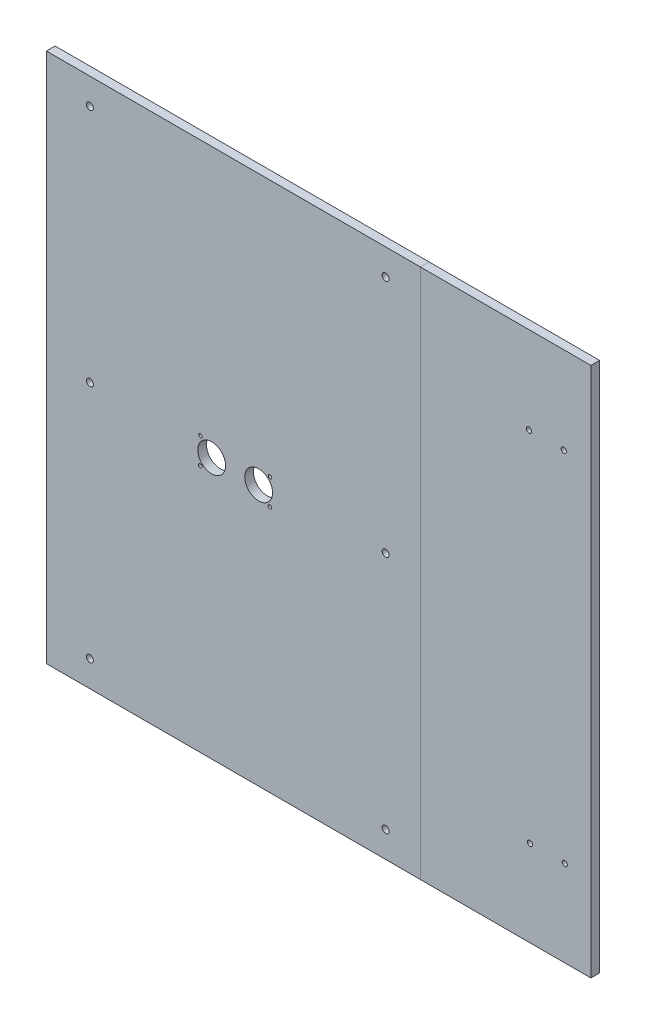
ISO-10303-21;
HEADER;
FILE_DESCRIPTION(('STEP AP214'),'2;1');
FILE_NAME('part.step','',(''),(''),'','','');
FILE_SCHEMA(('AUTOMOTIVE_DESIGN { 1 0 10303 214 1 1 1 1 }'));
ENDSEC;
DATA;
#1=APPLICATION_CONTEXT('core data for automotive mechanical design processes');
#2=APPLICATION_PROTOCOL_DEFINITION('international standard','automotive_design',2000,#1);
#3=PRODUCT_CONTEXT('',#1,'mechanical');
#4=PRODUCT('Part','Part','',(#3));
#5=PRODUCT_RELATED_PRODUCT_CATEGORY('part','',(#4));
#6=PRODUCT_DEFINITION_FORMATION('','',#4);
#7=PRODUCT_DEFINITION_CONTEXT('part definition',#1,'design');
#8=PRODUCT_DEFINITION('design','',#6,#7);
#9=PRODUCT_DEFINITION_SHAPE('','',#8);
#10=(LENGTH_UNIT() NAMED_UNIT(*) SI_UNIT(.MILLI.,.METRE.));
#11=(NAMED_UNIT(*) PLANE_ANGLE_UNIT() SI_UNIT($,.RADIAN.));
#12=(NAMED_UNIT(*) SI_UNIT($,.STERADIAN.) SOLID_ANGLE_UNIT());
#13=UNCERTAINTY_MEASURE_WITH_UNIT(LENGTH_MEASURE(1.E-05),#10,'distance_accuracy_value','');
#14=(GEOMETRIC_REPRESENTATION_CONTEXT(3) GLOBAL_UNCERTAINTY_ASSIGNED_CONTEXT((#13)) GLOBAL_UNIT_ASSIGNED_CONTEXT((#10,
#11,#12)) REPRESENTATION_CONTEXT('',''));
#15=CARTESIAN_POINT('',(0.,0.,0.));
#16=DIRECTION('',(0.,0.,1.));
#17=DIRECTION('',(1.,0.,0.));
#18=AXIS2_PLACEMENT_3D('',#15,#16,#17);
#19=CARTESIAN_POINT('',(215.,305.,5.));
#20=DIRECTION('',(-1.,0.,0.));
#21=DIRECTION('',(0.,0.,1.));
#22=AXIS2_PLACEMENT_3D('',#19,#20,#21);
#23=PLANE('',#22);
#24=DIRECTION('',(0.,1.,0.));
#25=VECTOR('',#24,1.);
#26=CARTESIAN_POINT('',(215.,305.,0.));
#27=LINE('',#26,#25);
#28=CARTESIAN_POINT('',(215.,0.,0.));
#29=VERTEX_POINT('',#28);
#30=CARTESIAN_POINT('',(215.,305.,0.));
#31=VERTEX_POINT('',#30);
#32=EDGE_CURVE('E108',#29,#31,#27,.T.);
#33=ORIENTED_EDGE('',*,*,#32,.F.);
#34=DIRECTION('',(0.,0.,-1.));
#35=VECTOR('',#34,1.);
#36=CARTESIAN_POINT('',(215.,0.,5.));
#37=LINE('',#36,#35);
#38=CARTESIAN_POINT('',(215.,0.,5.));
#39=VERTEX_POINT('',#38);
#40=EDGE_CURVE('E12',#39,#29,#37,.T.);
#41=ORIENTED_EDGE('',*,*,#40,.F.);
#42=DIRECTION('',(0.,1.,0.));
#43=VECTOR('',#42,1.);
#44=CARTESIAN_POINT('',(215.,305.,5.));
#45=LINE('',#44,#43);
#46=CARTESIAN_POINT('',(215.,305.,5.));
#47=VERTEX_POINT('',#46);
#48=EDGE_CURVE('E101',#39,#47,#45,.T.);
#49=ORIENTED_EDGE('',*,*,#48,.T.);
#50=DIRECTION('',(0.,0.,-1.));
#51=VECTOR('',#50,1.);
#52=CARTESIAN_POINT('',(215.,305.,5.));
#53=LINE('',#52,#51);
#54=EDGE_CURVE('E46',#47,#31,#53,.T.);
#55=ORIENTED_EDGE('',*,*,#54,.T.);
#56=EDGE_LOOP('',(#33,#41,#49,#55));
#57=FACE_BOUND('',#56,.T.);
#58=ADVANCED_FACE('F43',(#57),#23,.T.);
#59=CARTESIAN_POINT('',(215.,0.,5.));
#60=DIRECTION('',(0.,-1.,0.));
#61=DIRECTION('',(1.,0.,0.));
#62=AXIS2_PLACEMENT_3D('',#59,#60,#61);
#63=PLANE('',#62);
#64=DIRECTION('',(-1.,0.,0.));
#65=VECTOR('',#64,1.);
#66=CARTESIAN_POINT('',(215.,0.,0.));
#67=LINE('',#66,#65);
#68=CARTESIAN_POINT('',(313.,0.,0.));
#69=VERTEX_POINT('',#68);
#70=EDGE_CURVE('E103',#69,#29,#67,.T.);
#71=ORIENTED_EDGE('',*,*,#70,.F.);
#72=DIRECTION('',(0.,0.,-1.));
#73=VECTOR('',#72,1.);
#74=CARTESIAN_POINT('',(313.,0.,5.));
#75=LINE('',#74,#73);
#76=CARTESIAN_POINT('',(313.,0.,5.));
#77=VERTEX_POINT('',#76);
#78=EDGE_CURVE('E52',#77,#69,#75,.T.);
#79=ORIENTED_EDGE('',*,*,#78,.F.);
#80=DIRECTION('',(-1.,0.,0.));
#81=VECTOR('',#80,1.);
#82=CARTESIAN_POINT('',(215.,0.,5.));
#83=LINE('',#82,#81);
#84=EDGE_CURVE('E98',#77,#39,#83,.T.);
#85=ORIENTED_EDGE('',*,*,#84,.T.);
#86=ORIENTED_EDGE('',*,*,#40,.T.);
#87=EDGE_LOOP('',(#71,#79,#85,#86));
#88=FACE_BOUND('',#87,.T.);
#89=ADVANCED_FACE('F119',(#88),#63,.T.);
#90=CARTESIAN_POINT('',(313.,305.,5.));
#91=DIRECTION('',(1.,0.,0.));
#92=DIRECTION('',(0.,0.,-1.));
#93=AXIS2_PLACEMENT_3D('',#90,#91,#92);
#94=PLANE('',#93);
#95=DIRECTION('',(0.,-1.,0.));
#96=VECTOR('',#95,1.);
#97=CARTESIAN_POINT('',(313.,305.,0.));
#98=LINE('',#97,#96);
#99=CARTESIAN_POINT('',(313.,305.,0.));
#100=VERTEX_POINT('',#99);
#101=EDGE_CURVE('E93',#100,#69,#98,.T.);
#102=ORIENTED_EDGE('',*,*,#101,.F.);
#103=DIRECTION('',(0.,0.,-1.));
#104=VECTOR('',#103,1.);
#105=CARTESIAN_POINT('',(313.,305.,5.));
#106=LINE('',#105,#104);
#107=CARTESIAN_POINT('',(313.,305.,5.));
#108=VERTEX_POINT('',#107);
#109=EDGE_CURVE('E88',#108,#100,#106,.T.);
#110=ORIENTED_EDGE('',*,*,#109,.F.);
#111=DIRECTION('',(0.,-1.,0.));
#112=VECTOR('',#111,1.);
#113=CARTESIAN_POINT('',(313.,305.,5.));
#114=LINE('',#113,#112);
#115=EDGE_CURVE('E91',#108,#77,#114,.T.);
#116=ORIENTED_EDGE('',*,*,#115,.T.);
#117=ORIENTED_EDGE('',*,*,#78,.T.);
#118=EDGE_LOOP('',(#102,#110,#116,#117));
#119=FACE_BOUND('',#118,.T.);
#120=ADVANCED_FACE('F90',(#119),#94,.T.);
#121=CARTESIAN_POINT('',(215.,305.,5.));
#122=DIRECTION('',(0.,1.,0.));
#123=DIRECTION('',(0.,0.,1.));
#124=AXIS2_PLACEMENT_3D('',#121,#122,#123);
#125=PLANE('',#124);
#126=DIRECTION('',(1.,0.,0.));
#127=VECTOR('',#126,1.);
#128=CARTESIAN_POINT('',(215.,305.,0.));
#129=LINE('',#128,#127);
#130=EDGE_CURVE('E111',#31,#100,#129,.T.);
#131=ORIENTED_EDGE('',*,*,#130,.F.);
#132=ORIENTED_EDGE('',*,*,#54,.F.);
#133=DIRECTION('',(1.,0.,0.));
#134=VECTOR('',#133,1.);
#135=CARTESIAN_POINT('',(215.,305.,5.));
#136=LINE('',#135,#134);
#137=EDGE_CURVE('E97',#47,#108,#136,.T.);
#138=ORIENTED_EDGE('',*,*,#137,.T.);
#139=ORIENTED_EDGE('',*,*,#109,.T.);
#140=EDGE_LOOP('',(#131,#132,#138,#139));
#141=FACE_BOUND('',#140,.T.);
#142=ADVANCED_FACE('F100',(#141),#125,.T.);
#143=CARTESIAN_POINT('',(0.,0.,5.));
#144=DIRECTION('',(0.,0.,1.));
#145=DIRECTION('',(1.,0.,0.));
#146=AXIS2_PLACEMENT_3D('',#143,#144,#145);
#147=PLANE('',#146);
#148=CARTESIAN_POINT('',(298.,49.5000000000006,5.));
#149=DIRECTION('',(0.,0.,1.));
#150=DIRECTION('',(1.,0.,0.));
#151=AXIS2_PLACEMENT_3D('',#148,#149,#150);
#152=CIRCLE('',#151,1.50000000000002);
#153=CARTESIAN_POINT('',(299.5,49.5000000000006,5.));
#154=VERTEX_POINT('',#153);
#155=EDGE_CURVE('E163',#154,#154,#152,.T.);
#156=ORIENTED_EDGE('',*,*,#155,.F.);
#157=EDGE_LOOP('',(#156));
#158=FACE_BOUND('',#157,.T.);
#159=CARTESIAN_POINT('',(278.,49.5000000000006,5.));
#160=DIRECTION('',(0.,0.,1.));
#161=DIRECTION('',(1.,0.,0.));
#162=AXIS2_PLACEMENT_3D('',#159,#160,#161);
#163=CIRCLE('',#162,1.50000000000002);
#164=CARTESIAN_POINT('',(279.5,49.5000000000006,5.));
#165=VERTEX_POINT('',#164);
#166=EDGE_CURVE('E165',#165,#165,#163,.T.);
#167=ORIENTED_EDGE('',*,*,#166,.F.);
#168=EDGE_LOOP('',(#167));
#169=FACE_BOUND('',#168,.T.);
#170=CARTESIAN_POINT('',(297.4,255.,5.));
#171=DIRECTION('',(0.,0.,-1.));
#172=DIRECTION('',(-1.,0.,0.));
#173=AXIS2_PLACEMENT_3D('',#170,#171,#172);
#174=CIRCLE('',#173,1.50000000000002);
#175=CARTESIAN_POINT('',(295.9,255.,5.));
#176=VERTEX_POINT('',#175);
#177=EDGE_CURVE('E174',#176,#176,#174,.T.);
#178=ORIENTED_EDGE('',*,*,#177,.T.);
#179=EDGE_LOOP('',(#178));
#180=FACE_BOUND('',#179,.T.);
#181=CARTESIAN_POINT('',(277.4,255.,5.));
#182=DIRECTION('',(0.,0.,-1.));
#183=DIRECTION('',(-1.,0.,0.));
#184=AXIS2_PLACEMENT_3D('',#181,#182,#183);
#185=CIRCLE('',#184,1.50000000000002);
#186=CARTESIAN_POINT('',(275.9,255.,5.));
#187=VERTEX_POINT('',#186);
#188=EDGE_CURVE('E112',#187,#187,#185,.T.);
#189=ORIENTED_EDGE('',*,*,#188,.T.);
#190=EDGE_LOOP('',(#189));
#191=FACE_BOUND('',#190,.T.);
#192=ORIENTED_EDGE('',*,*,#48,.F.);
#193=ORIENTED_EDGE('',*,*,#84,.F.);
#194=ORIENTED_EDGE('',*,*,#115,.F.);
#195=ORIENTED_EDGE('',*,*,#137,.F.);
#196=EDGE_LOOP('',(#192,#193,#194,#195));
#197=FACE_BOUND('',#196,.T.);
#198=ADVANCED_FACE('F96',(#158,#169,#180,#191,#197),#147,.T.);
#199=CARTESIAN_POINT('',(0.,0.,0.));
#200=DIRECTION('',(0.,0.,1.));
#201=DIRECTION('',(1.,0.,0.));
#202=AXIS2_PLACEMENT_3D('',#199,#200,#201);
#203=PLANE('',#202);
#204=CARTESIAN_POINT('',(298.,49.5000000000006,0.));
#205=DIRECTION('',(0.,0.,1.));
#206=DIRECTION('',(1.,0.,0.));
#207=AXIS2_PLACEMENT_3D('',#204,#205,#206);
#208=CIRCLE('',#207,1.50000000000002);
#209=CARTESIAN_POINT('',(299.5,49.5000000000006,0.));
#210=VERTEX_POINT('',#209);
#211=EDGE_CURVE('E161',#210,#210,#208,.T.);
#212=ORIENTED_EDGE('',*,*,#211,.T.);
#213=EDGE_LOOP('',(#212));
#214=FACE_BOUND('',#213,.T.);
#215=CARTESIAN_POINT('',(278.,49.5000000000006,0.));
#216=DIRECTION('',(0.,0.,1.));
#217=DIRECTION('',(1.,0.,0.));
#218=AXIS2_PLACEMENT_3D('',#215,#216,#217);
#219=CIRCLE('',#218,1.50000000000002);
#220=CARTESIAN_POINT('',(279.5,49.5000000000006,0.));
#221=VERTEX_POINT('',#220);
#222=EDGE_CURVE('E168',#221,#221,#219,.T.);
#223=ORIENTED_EDGE('',*,*,#222,.T.);
#224=EDGE_LOOP('',(#223));
#225=FACE_BOUND('',#224,.T.);
#226=CARTESIAN_POINT('',(297.4,255.,0.));
#227=DIRECTION('',(0.,0.,-1.));
#228=DIRECTION('',(-1.,0.,0.));
#229=AXIS2_PLACEMENT_3D('',#226,#227,#228);
#230=CIRCLE('',#229,1.50000000000002);
#231=CARTESIAN_POINT('',(295.9,255.,0.));
#232=VERTEX_POINT('',#231);
#233=EDGE_CURVE('E171',#232,#232,#230,.T.);
#234=ORIENTED_EDGE('',*,*,#233,.F.);
#235=EDGE_LOOP('',(#234));
#236=FACE_BOUND('',#235,.T.);
#237=CARTESIAN_POINT('',(277.4,255.,0.));
#238=DIRECTION('',(0.,0.,-1.));
#239=DIRECTION('',(-1.,0.,0.));
#240=AXIS2_PLACEMENT_3D('',#237,#238,#239);
#241=CIRCLE('',#240,1.50000000000002);
#242=CARTESIAN_POINT('',(275.9,255.,0.));
#243=VERTEX_POINT('',#242);
#244=EDGE_CURVE('E177',#243,#243,#241,.T.);
#245=ORIENTED_EDGE('',*,*,#244,.F.);
#246=EDGE_LOOP('',(#245));
#247=FACE_BOUND('',#246,.T.);
#248=ORIENTED_EDGE('',*,*,#32,.T.);
#249=ORIENTED_EDGE('',*,*,#130,.T.);
#250=ORIENTED_EDGE('',*,*,#101,.T.);
#251=ORIENTED_EDGE('',*,*,#70,.T.);
#252=EDGE_LOOP('',(#248,#249,#250,#251));
#253=FACE_BOUND('',#252,.T.);
#254=ADVANCED_FACE('F118',(#214,#225,#236,#247,#253),#203,.F.);
#255=CARTESIAN_POINT('',(277.4,255.,5.));
#256=DIRECTION('',(0.,0.,-1.));
#257=DIRECTION('',(-1.,0.,0.));
#258=AXIS2_PLACEMENT_3D('',#255,#256,#257);
#259=CYLINDRICAL_SURFACE('',#258,1.50000000000002);
#260=ORIENTED_EDGE('',*,*,#188,.F.);
#261=EDGE_LOOP('',(#260));
#262=FACE_BOUND('',#261,.T.);
#263=ORIENTED_EDGE('',*,*,#244,.T.);
#264=EDGE_LOOP('',(#263));
#265=FACE_BOUND('',#264,.T.);
#266=ADVANCED_FACE('F137',(#262,#265),#259,.F.);
#267=CARTESIAN_POINT('',(297.4,255.,5.));
#268=DIRECTION('',(0.,0.,-1.));
#269=DIRECTION('',(-1.,0.,0.));
#270=AXIS2_PLACEMENT_3D('',#267,#268,#269);
#271=CYLINDRICAL_SURFACE('',#270,1.50000000000002);
#272=ORIENTED_EDGE('',*,*,#177,.F.);
#273=EDGE_LOOP('',(#272));
#274=FACE_BOUND('',#273,.T.);
#275=ORIENTED_EDGE('',*,*,#233,.T.);
#276=EDGE_LOOP('',(#275));
#277=FACE_BOUND('',#276,.T.);
#278=ADVANCED_FACE('F144',(#274,#277),#271,.F.);
#279=CARTESIAN_POINT('',(278.,49.5000000000006,0.));
#280=DIRECTION('',(0.,0.,1.));
#281=DIRECTION('',(1.,0.,0.));
#282=AXIS2_PLACEMENT_3D('',#279,#280,#281);
#283=CYLINDRICAL_SURFACE('',#282,1.50000000000002);
#284=ORIENTED_EDGE('',*,*,#222,.F.);
#285=EDGE_LOOP('',(#284));
#286=FACE_BOUND('',#285,.T.);
#287=ORIENTED_EDGE('',*,*,#166,.T.);
#288=EDGE_LOOP('',(#287));
#289=FACE_BOUND('',#288,.T.);
#290=ADVANCED_FACE('F148',(#286,#289),#283,.F.);
#291=CARTESIAN_POINT('',(298.,49.5000000000006,0.));
#292=DIRECTION('',(0.,0.,1.));
#293=DIRECTION('',(1.,0.,0.));
#294=AXIS2_PLACEMENT_3D('',#291,#292,#293);
#295=CYLINDRICAL_SURFACE('',#294,1.50000000000002);
#296=ORIENTED_EDGE('',*,*,#211,.F.);
#297=EDGE_LOOP('',(#296));
#298=FACE_BOUND('',#297,.T.);
#299=ORIENTED_EDGE('',*,*,#155,.T.);
#300=EDGE_LOOP('',(#299));
#301=FACE_BOUND('',#300,.T.);
#302=ADVANCED_FACE('F152',(#298,#301),#295,.F.);
#303=CLOSED_SHELL('',(#58,#89,#120,#142,#198,#254,#266,#278,#290,#302));
#304=MANIFOLD_SOLID_BREP('B2',#303);
#305=CARTESIAN_POINT('',(0.,0.,5.));
#306=DIRECTION('',(1.,0.,0.));
#307=DIRECTION('',(0.,0.,-1.));
#308=AXIS2_PLACEMENT_3D('',#305,#306,#307);
#309=PLANE('',#308);
#310=DIRECTION('',(0.,-1.,0.));
#311=VECTOR('',#310,1.);
#312=CARTESIAN_POINT('',(0.,0.,0.));
#313=LINE('',#312,#311);
#314=CARTESIAN_POINT('',(0.,305.,0.));
#315=VERTEX_POINT('',#314);
#316=CARTESIAN_POINT('',(0.,0.,0.));
#317=VERTEX_POINT('',#316);
#318=EDGE_CURVE('E313',#315,#317,#313,.T.);
#319=ORIENTED_EDGE('',*,*,#318,.T.);
#320=DIRECTION('',(0.,0.,-1.));
#321=VECTOR('',#320,1.);
#322=CARTESIAN_POINT('',(0.,0.,5.));
#323=LINE('',#322,#321);
#324=CARTESIAN_POINT('',(0.,0.,5.));
#325=VERTEX_POINT('',#324);
#326=EDGE_CURVE('E41',#325,#317,#323,.T.);
#327=ORIENTED_EDGE('',*,*,#326,.F.);
#328=DIRECTION('',(0.,-1.,0.));
#329=VECTOR('',#328,1.);
#330=CARTESIAN_POINT('',(0.,0.,5.));
#331=LINE('',#330,#329);
#332=CARTESIAN_POINT('',(0.,305.,5.));
#333=VERTEX_POINT('',#332);
#334=EDGE_CURVE('E301',#333,#325,#331,.T.);
#335=ORIENTED_EDGE('',*,*,#334,.F.);
#336=DIRECTION('',(0.,0.,-1.));
#337=VECTOR('',#336,1.);
#338=CARTESIAN_POINT('',(0.,305.,5.));
#339=LINE('',#338,#337);
#340=EDGE_CURVE('E309',#333,#315,#339,.T.);
#341=ORIENTED_EDGE('',*,*,#340,.T.);
#342=EDGE_LOOP('',(#319,#327,#335,#341));
#343=FACE_BOUND('',#342,.T.);
#344=ADVANCED_FACE('F250',(#343),#309,.F.);
#345=CARTESIAN_POINT('',(0.,0.,5.));
#346=DIRECTION('',(0.,1.,0.));
#347=DIRECTION('',(0.,0.,1.));
#348=AXIS2_PLACEMENT_3D('',#345,#346,#347);
#349=PLANE('',#348);
#350=DIRECTION('',(1.,0.,0.));
#351=VECTOR('',#350,1.);
#352=CARTESIAN_POINT('',(0.,0.,0.));
#353=LINE('',#352,#351);
#354=CARTESIAN_POINT('',(215.,0.,0.));
#355=VERTEX_POINT('',#354);
#356=EDGE_CURVE('E305',#317,#355,#353,.T.);
#357=ORIENTED_EDGE('',*,*,#356,.T.);
#358=DIRECTION('',(0.,0.,-1.));
#359=VECTOR('',#358,1.);
#360=CARTESIAN_POINT('',(215.,0.,5.));
#361=LINE('',#360,#359);
#362=CARTESIAN_POINT('',(215.,0.,5.));
#363=VERTEX_POINT('',#362);
#364=EDGE_CURVE('E258',#363,#355,#361,.T.);
#365=ORIENTED_EDGE('',*,*,#364,.F.);
#366=DIRECTION('',(1.,0.,0.));
#367=VECTOR('',#366,1.);
#368=CARTESIAN_POINT('',(0.,0.,5.));
#369=LINE('',#368,#367);
#370=EDGE_CURVE('E296',#325,#363,#369,.T.);
#371=ORIENTED_EDGE('',*,*,#370,.F.);
#372=ORIENTED_EDGE('',*,*,#326,.T.);
#373=EDGE_LOOP('',(#357,#365,#371,#372));
#374=FACE_BOUND('',#373,.T.);
#375=ADVANCED_FACE('F304',(#374),#349,.F.);
#376=CARTESIAN_POINT('',(215.,0.,5.));
#377=DIRECTION('',(-1.,0.,0.));
#378=DIRECTION('',(0.,0.,1.));
#379=AXIS2_PLACEMENT_3D('',#376,#377,#378);
#380=PLANE('',#379);
#381=DIRECTION('',(0.,1.,0.));
#382=VECTOR('',#381,1.);
#383=CARTESIAN_POINT('',(215.,0.,0.));
#384=LINE('',#383,#382);
#385=CARTESIAN_POINT('',(215.,305.,0.));
#386=VERTEX_POINT('',#385);
#387=EDGE_CURVE('E283',#355,#386,#384,.T.);
#388=ORIENTED_EDGE('',*,*,#387,.T.);
#389=DIRECTION('',(0.,0.,-1.));
#390=VECTOR('',#389,1.);
#391=CARTESIAN_POINT('',(215.,305.,5.));
#392=LINE('',#391,#390);
#393=CARTESIAN_POINT('',(215.,305.,5.));
#394=VERTEX_POINT('',#393);
#395=EDGE_CURVE('E306',#394,#386,#392,.T.);
#396=ORIENTED_EDGE('',*,*,#395,.F.);
#397=DIRECTION('',(0.,1.,0.));
#398=VECTOR('',#397,1.);
#399=CARTESIAN_POINT('',(215.,0.,5.));
#400=LINE('',#399,#398);
#401=EDGE_CURVE('E299',#363,#394,#400,.T.);
#402=ORIENTED_EDGE('',*,*,#401,.F.);
#403=ORIENTED_EDGE('',*,*,#364,.T.);
#404=EDGE_LOOP('',(#388,#396,#402,#403));
#405=FACE_BOUND('',#404,.T.);
#406=ADVANCED_FACE('F307',(#405),#380,.F.);
#407=CARTESIAN_POINT('',(0.,305.,5.));
#408=DIRECTION('',(0.,-1.,0.));
#409=DIRECTION('',(0.,0.,-1.));
#410=AXIS2_PLACEMENT_3D('',#407,#408,#409);
#411=PLANE('',#410);
#412=DIRECTION('',(-1.,0.,0.));
#413=VECTOR('',#412,1.);
#414=CARTESIAN_POINT('',(0.,305.,0.));
#415=LINE('',#414,#413);
#416=EDGE_CURVE('E289',#386,#315,#415,.T.);
#417=ORIENTED_EDGE('',*,*,#416,.T.);
#418=ORIENTED_EDGE('',*,*,#340,.F.);
#419=DIRECTION('',(-1.,0.,0.));
#420=VECTOR('',#419,1.);
#421=CARTESIAN_POINT('',(0.,305.,5.));
#422=LINE('',#421,#420);
#423=EDGE_CURVE('E266',#394,#333,#422,.T.);
#424=ORIENTED_EDGE('',*,*,#423,.F.);
#425=ORIENTED_EDGE('',*,*,#395,.T.);
#426=EDGE_LOOP('',(#417,#418,#424,#425));
#427=FACE_BOUND('',#426,.T.);
#428=ADVANCED_FACE('F321',(#427),#411,.F.);
#429=CARTESIAN_POINT('',(0.,0.,5.));
#430=DIRECTION('',(0.,0.,-1.));
#431=DIRECTION('',(-1.,0.,0.));
#432=AXIS2_PLACEMENT_3D('',#429,#430,#431);
#433=PLANE('',#432);
#434=CARTESIAN_POINT('',(128.451980771845,142.285475877277,5.));
#435=DIRECTION('',(0.,0.,-1.));
#436=DIRECTION('',(-1.,0.,0.));
#437=AXIS2_PLACEMENT_3D('',#434,#435,#436);
#438=CIRCLE('',#437,0.999999999999998);
#439=CARTESIAN_POINT('',(127.451980771845,142.285475877277,5.));
#440=VERTEX_POINT('',#439);
#441=EDGE_CURVE('E378',#440,#440,#438,.T.);
#442=ORIENTED_EDGE('',*,*,#441,.T.);
#443=EDGE_LOOP('',(#442));
#444=FACE_BOUND('',#443,.T.);
#445=CARTESIAN_POINT('',(88.5480363246736,157.714598256853,5.));
#446=DIRECTION('',(0.,0.,-1.));
#447=DIRECTION('',(-1.,0.,0.));
#448=AXIS2_PLACEMENT_3D('',#445,#446,#447);
#449=CIRCLE('',#448,0.999999999999998);
#450=CARTESIAN_POINT('',(87.5480363246736,157.714598256853,5.));
#451=VERTEX_POINT('',#450);
#452=EDGE_CURVE('E390',#451,#451,#449,.T.);
#453=ORIENTED_EDGE('',*,*,#452,.T.);
#454=EDGE_LOOP('',(#453));
#455=FACE_BOUND('',#454,.T.);
#456=CARTESIAN_POINT('',(88.4519475760372,142.714598256853,5.));
#457=DIRECTION('',(0.,0.,-1.));
#458=DIRECTION('',(-1.,0.,0.));
#459=AXIS2_PLACEMENT_3D('',#456,#457,#458);
#460=CIRCLE('',#459,0.999999999999998);
#461=CARTESIAN_POINT('',(87.4519475760372,142.714598256853,5.));
#462=VERTEX_POINT('',#461);
#463=EDGE_CURVE('E384',#462,#462,#460,.T.);
#464=ORIENTED_EDGE('',*,*,#463,.T.);
#465=EDGE_LOOP('',(#464));
#466=FACE_BOUND('',#465,.T.);
#467=CARTESIAN_POINT('',(128.548036324674,157.285475877277,5.));
#468=DIRECTION('',(0.,0.,-1.));
#469=DIRECTION('',(-1.,0.,0.));
#470=AXIS2_PLACEMENT_3D('',#467,#468,#469);
#471=CIRCLE('',#470,0.999999999999998);
#472=CARTESIAN_POINT('',(127.548036324674,157.285475877277,5.));
#473=VERTEX_POINT('',#472);
#474=EDGE_CURVE('E372',#473,#473,#471,.T.);
#475=ORIENTED_EDGE('',*,*,#474,.T.);
#476=EDGE_LOOP('',(#475));
#477=FACE_BOUND('',#476,.T.);
#478=CARTESIAN_POINT('',(95.,150.,5.));
#479=DIRECTION('',(0.,0.,-1.));
#480=DIRECTION('',(-1.,0.,0.));
#481=AXIS2_PLACEMENT_3D('',#478,#479,#480);
#482=CIRCLE('',#481,8.00000000000003);
#483=CARTESIAN_POINT('',(87.,150.,5.));
#484=VERTEX_POINT('',#483);
#485=EDGE_CURVE('E366',#484,#484,#482,.T.);
#486=ORIENTED_EDGE('',*,*,#485,.T.);
#487=EDGE_LOOP('',(#486));
#488=FACE_BOUND('',#487,.T.);
#489=CARTESIAN_POINT('',(122.,150.,5.));
#490=DIRECTION('',(0.,0.,-1.));
#491=DIRECTION('',(-1.,0.,0.));
#492=AXIS2_PLACEMENT_3D('',#489,#490,#491);
#493=CIRCLE('',#492,8.00000000000003);
#494=CARTESIAN_POINT('',(114.,150.,5.));
#495=VERTEX_POINT('',#494);
#496=EDGE_CURVE('E349',#495,#495,#493,.T.);
#497=ORIENTED_EDGE('',*,*,#496,.T.);
#498=EDGE_LOOP('',(#497));
#499=FACE_BOUND('',#498,.T.);
#500=CARTESIAN_POINT('',(25.,152.5,5.));
#501=DIRECTION('',(0.,0.,-1.));
#502=DIRECTION('',(-1.,0.,0.));
#503=AXIS2_PLACEMENT_3D('',#500,#501,#502);
#504=CIRCLE('',#503,2.);
#505=CARTESIAN_POINT('',(23.,152.5,5.));
#506=VERTEX_POINT('',#505);
#507=EDGE_CURVE('E348',#506,#506,#504,.T.);
#508=ORIENTED_EDGE('',*,*,#507,.T.);
#509=EDGE_LOOP('',(#508));
#510=FACE_BOUND('',#509,.T.);
#511=CARTESIAN_POINT('',(195.,152.5,5.));
#512=DIRECTION('',(0.,0.,-1.));
#513=DIRECTION('',(-1.,0.,0.));
#514=AXIS2_PLACEMENT_3D('',#511,#512,#513);
#515=CIRCLE('',#514,2.);
#516=CARTESIAN_POINT('',(193.,152.5,5.));
#517=VERTEX_POINT('',#516);
#518=EDGE_CURVE('E355',#517,#517,#515,.T.);
#519=ORIENTED_EDGE('',*,*,#518,.T.);
#520=EDGE_LOOP('',(#519));
#521=FACE_BOUND('',#520,.T.);
#522=CARTESIAN_POINT('',(195.,15.,5.));
#523=DIRECTION('',(0.,0.,-1.));
#524=DIRECTION('',(-1.,0.,0.));
#525=AXIS2_PLACEMENT_3D('',#522,#523,#524);
#526=CIRCLE('',#525,2.);
#527=CARTESIAN_POINT('',(193.,15.,5.));
#528=VERTEX_POINT('',#527);
#529=EDGE_CURVE('E337',#528,#528,#526,.T.);
#530=ORIENTED_EDGE('',*,*,#529,.T.);
#531=EDGE_LOOP('',(#530));
#532=FACE_BOUND('',#531,.T.);
#533=CARTESIAN_POINT('',(25.,15.,5.));
#534=DIRECTION('',(0.,0.,-1.));
#535=DIRECTION('',(-1.,0.,0.));
#536=AXIS2_PLACEMENT_3D('',#533,#534,#535);
#537=CIRCLE('',#536,2.);
#538=CARTESIAN_POINT('',(23.,15.,5.));
#539=VERTEX_POINT('',#538);
#540=EDGE_CURVE('E336',#539,#539,#537,.T.);
#541=ORIENTED_EDGE('',*,*,#540,.T.);
#542=EDGE_LOOP('',(#541));
#543=FACE_BOUND('',#542,.T.);
#544=CARTESIAN_POINT('',(25.,290.,5.));
#545=DIRECTION('',(0.,0.,-1.));
#546=DIRECTION('',(-1.,0.,0.));
#547=AXIS2_PLACEMENT_3D('',#544,#545,#546);
#548=CIRCLE('',#547,2.00000000000001);
#549=CARTESIAN_POINT('',(23.,290.,5.));
#550=VERTEX_POINT('',#549);
#551=EDGE_CURVE('E330',#550,#550,#548,.T.);
#552=ORIENTED_EDGE('',*,*,#551,.T.);
#553=EDGE_LOOP('',(#552));
#554=FACE_BOUND('',#553,.T.);
#555=CARTESIAN_POINT('',(195.,290.,5.));
#556=DIRECTION('',(0.,0.,-1.));
#557=DIRECTION('',(-1.,0.,0.));
#558=AXIS2_PLACEMENT_3D('',#555,#556,#557);
#559=CIRCLE('',#558,2.);
#560=CARTESIAN_POINT('',(193.,290.,5.));
#561=VERTEX_POINT('',#560);
#562=EDGE_CURVE('E316',#561,#561,#559,.T.);
#563=ORIENTED_EDGE('',*,*,#562,.T.);
#564=EDGE_LOOP('',(#563));
#565=FACE_BOUND('',#564,.T.);
#566=ORIENTED_EDGE('',*,*,#334,.T.);
#567=ORIENTED_EDGE('',*,*,#370,.T.);
#568=ORIENTED_EDGE('',*,*,#401,.T.);
#569=ORIENTED_EDGE('',*,*,#423,.T.);
#570=EDGE_LOOP('',(#566,#567,#568,#569));
#571=FACE_BOUND('',#570,.T.);
#572=ADVANCED_FACE('F297',(#444,#455,#466,#477,#488,#499,#510,#521,#532,#543,#554,#565,#571),
#433,.F.);
#573=CARTESIAN_POINT('',(0.,0.,0.));
#574=DIRECTION('',(0.,0.,-1.));
#575=DIRECTION('',(-1.,0.,0.));
#576=AXIS2_PLACEMENT_3D('',#573,#574,#575);
#577=PLANE('',#576);
#578=CARTESIAN_POINT('',(128.451980771845,142.285475877277,0.));
#579=DIRECTION('',(0.,0.,-1.));
#580=DIRECTION('',(-1.,0.,0.));
#581=AXIS2_PLACEMENT_3D('',#578,#579,#580);
#582=CIRCLE('',#581,0.999999999999998);
#583=CARTESIAN_POINT('',(127.451980771845,142.285475877277,0.));
#584=VERTEX_POINT('',#583);
#585=EDGE_CURVE('E393',#584,#584,#582,.T.);
#586=ORIENTED_EDGE('',*,*,#585,.F.);
#587=EDGE_LOOP('',(#586));
#588=FACE_BOUND('',#587,.T.);
#589=CARTESIAN_POINT('',(88.5480363246736,157.714598256853,0.));
#590=DIRECTION('',(0.,0.,-1.));
#591=DIRECTION('',(-1.,0.,0.));
#592=AXIS2_PLACEMENT_3D('',#589,#590,#591);
#593=CIRCLE('',#592,0.999999999999998);
#594=CARTESIAN_POINT('',(87.5480363246736,157.714598256853,0.));
#595=VERTEX_POINT('',#594);
#596=EDGE_CURVE('E387',#595,#595,#593,.T.);
#597=ORIENTED_EDGE('',*,*,#596,.F.);
#598=EDGE_LOOP('',(#597));
#599=FACE_BOUND('',#598,.T.);
#600=CARTESIAN_POINT('',(88.4519475760372,142.714598256853,0.));
#601=DIRECTION('',(0.,0.,-1.));
#602=DIRECTION('',(-1.,0.,0.));
#603=AXIS2_PLACEMENT_3D('',#600,#601,#602);
#604=CIRCLE('',#603,0.999999999999998);
#605=CARTESIAN_POINT('',(87.4519475760372,142.714598256853,0.));
#606=VERTEX_POINT('',#605);
#607=EDGE_CURVE('E381',#606,#606,#604,.T.);
#608=ORIENTED_EDGE('',*,*,#607,.F.);
#609=EDGE_LOOP('',(#608));
#610=FACE_BOUND('',#609,.T.);
#611=CARTESIAN_POINT('',(128.548036324674,157.285475877277,0.));
#612=DIRECTION('',(0.,0.,-1.));
#613=DIRECTION('',(-1.,0.,0.));
#614=AXIS2_PLACEMENT_3D('',#611,#612,#613);
#615=CIRCLE('',#614,0.999999999999998);
#616=CARTESIAN_POINT('',(127.548036324674,157.285475877277,0.));
#617=VERTEX_POINT('',#616);
#618=EDGE_CURVE('E375',#617,#617,#615,.T.);
#619=ORIENTED_EDGE('',*,*,#618,.F.);
#620=EDGE_LOOP('',(#619));
#621=FACE_BOUND('',#620,.T.);
#622=CARTESIAN_POINT('',(95.,150.,0.));
#623=DIRECTION('',(0.,0.,-1.));
#624=DIRECTION('',(-1.,0.,0.));
#625=AXIS2_PLACEMENT_3D('',#622,#623,#624);
#626=CIRCLE('',#625,8.00000000000003);
#627=CARTESIAN_POINT('',(87.,150.,0.));
#628=VERTEX_POINT('',#627);
#629=EDGE_CURVE('E369',#628,#628,#626,.T.);
#630=ORIENTED_EDGE('',*,*,#629,.F.);
#631=EDGE_LOOP('',(#630));
#632=FACE_BOUND('',#631,.T.);
#633=CARTESIAN_POINT('',(122.,150.,0.));
#634=DIRECTION('',(0.,0.,-1.));
#635=DIRECTION('',(-1.,0.,0.));
#636=AXIS2_PLACEMENT_3D('',#633,#634,#635);
#637=CIRCLE('',#636,8.00000000000003);
#638=CARTESIAN_POINT('',(114.,150.,0.));
#639=VERTEX_POINT('',#638);
#640=EDGE_CURVE('E363',#639,#639,#637,.T.);
#641=ORIENTED_EDGE('',*,*,#640,.F.);
#642=EDGE_LOOP('',(#641));
#643=FACE_BOUND('',#642,.T.);
#644=CARTESIAN_POINT('',(25.,152.5,0.));
#645=DIRECTION('',(0.,0.,-1.));
#646=DIRECTION('',(-1.,0.,0.));
#647=AXIS2_PLACEMENT_3D('',#644,#645,#646);
#648=CIRCLE('',#647,2.);
#649=CARTESIAN_POINT('',(23.,152.5,0.));
#650=VERTEX_POINT('',#649);
#651=EDGE_CURVE('E345',#650,#650,#648,.T.);
#652=ORIENTED_EDGE('',*,*,#651,.F.);
#653=EDGE_LOOP('',(#652));
#654=FACE_BOUND('',#653,.T.);
#655=CARTESIAN_POINT('',(195.,152.5,0.));
#656=DIRECTION('',(0.,0.,-1.));
#657=DIRECTION('',(-1.,0.,0.));
#658=AXIS2_PLACEMENT_3D('',#655,#656,#657);
#659=CIRCLE('',#658,2.);
#660=CARTESIAN_POINT('',(193.,152.5,0.));
#661=VERTEX_POINT('',#660);
#662=EDGE_CURVE('E352',#661,#661,#659,.T.);
#663=ORIENTED_EDGE('',*,*,#662,.F.);
#664=EDGE_LOOP('',(#663));
#665=FACE_BOUND('',#664,.T.);
#666=CARTESIAN_POINT('',(195.,15.,0.));
#667=DIRECTION('',(0.,0.,-1.));
#668=DIRECTION('',(-1.,0.,0.));
#669=AXIS2_PLACEMENT_3D('',#666,#667,#668);
#670=CIRCLE('',#669,2.);
#671=CARTESIAN_POINT('',(193.,15.,0.));
#672=VERTEX_POINT('',#671);
#673=EDGE_CURVE('E358',#672,#672,#670,.T.);
#674=ORIENTED_EDGE('',*,*,#673,.F.);
#675=EDGE_LOOP('',(#674));
#676=FACE_BOUND('',#675,.T.);
#677=CARTESIAN_POINT('',(25.,15.,0.));
#678=DIRECTION('',(0.,0.,-1.));
#679=DIRECTION('',(-1.,0.,0.));
#680=AXIS2_PLACEMENT_3D('',#677,#678,#679);
#681=CIRCLE('',#680,2.);
#682=CARTESIAN_POINT('',(23.,15.,0.));
#683=VERTEX_POINT('',#682);
#684=EDGE_CURVE('E333',#683,#683,#681,.T.);
#685=ORIENTED_EDGE('',*,*,#684,.F.);
#686=EDGE_LOOP('',(#685));
#687=FACE_BOUND('',#686,.T.);
#688=CARTESIAN_POINT('',(25.,290.,0.));
#689=DIRECTION('',(0.,0.,-1.));
#690=DIRECTION('',(-1.,0.,0.));
#691=AXIS2_PLACEMENT_3D('',#688,#689,#690);
#692=CIRCLE('',#691,2.00000000000001);
#693=CARTESIAN_POINT('',(23.,290.,0.));
#694=VERTEX_POINT('',#693);
#695=EDGE_CURVE('E340',#694,#694,#692,.T.);
#696=ORIENTED_EDGE('',*,*,#695,.F.);
#697=EDGE_LOOP('',(#696));
#698=FACE_BOUND('',#697,.T.);
#699=CARTESIAN_POINT('',(195.,290.,0.));
#700=DIRECTION('',(0.,0.,-1.));
#701=DIRECTION('',(-1.,0.,0.));
#702=AXIS2_PLACEMENT_3D('',#699,#700,#701);
#703=CIRCLE('',#702,2.);
#704=CARTESIAN_POINT('',(193.,290.,0.));
#705=VERTEX_POINT('',#704);
#706=EDGE_CURVE('E327',#705,#705,#703,.T.);
#707=ORIENTED_EDGE('',*,*,#706,.F.);
#708=EDGE_LOOP('',(#707));
#709=FACE_BOUND('',#708,.T.);
#710=ORIENTED_EDGE('',*,*,#318,.F.);
#711=ORIENTED_EDGE('',*,*,#416,.F.);
#712=ORIENTED_EDGE('',*,*,#387,.F.);
#713=ORIENTED_EDGE('',*,*,#356,.F.);
#714=EDGE_LOOP('',(#710,#711,#712,#713));
#715=FACE_BOUND('',#714,.T.);
#716=ADVANCED_FACE('F324',(#588,#599,#610,#621,#632,#643,#654,#665,#676,#687,#698,#709,#715),
#577,.T.);
#717=CARTESIAN_POINT('',(195.,290.,5.));
#718=DIRECTION('',(0.,0.,-1.));
#719=DIRECTION('',(-1.,0.,0.));
#720=AXIS2_PLACEMENT_3D('',#717,#718,#719);
#721=CYLINDRICAL_SURFACE('',#720,2.);
#722=ORIENTED_EDGE('',*,*,#562,.F.);
#723=EDGE_LOOP('',(#722));
#724=FACE_BOUND('',#723,.T.);
#725=ORIENTED_EDGE('',*,*,#706,.T.);
#726=EDGE_LOOP('',(#725));
#727=FACE_BOUND('',#726,.T.);
#728=ADVANCED_FACE('F410',(#724,#727),#721,.F.);
#729=CARTESIAN_POINT('',(25.,290.,5.));
#730=DIRECTION('',(0.,0.,-1.));
#731=DIRECTION('',(-1.,0.,0.));
#732=AXIS2_PLACEMENT_3D('',#729,#730,#731);
#733=CYLINDRICAL_SURFACE('',#732,2.00000000000001);
#734=ORIENTED_EDGE('',*,*,#551,.F.);
#735=EDGE_LOOP('',(#734));
#736=FACE_BOUND('',#735,.T.);
#737=ORIENTED_EDGE('',*,*,#695,.T.);
#738=EDGE_LOOP('',(#737));
#739=FACE_BOUND('',#738,.T.);
#740=ADVANCED_FACE('F435',(#736,#739),#733,.F.);
#741=CARTESIAN_POINT('',(25.,15.,5.));
#742=DIRECTION('',(0.,0.,-1.));
#743=DIRECTION('',(-1.,0.,0.));
#744=AXIS2_PLACEMENT_3D('',#741,#742,#743);
#745=CYLINDRICAL_SURFACE('',#744,2.);
#746=ORIENTED_EDGE('',*,*,#540,.F.);
#747=EDGE_LOOP('',(#746));
#748=FACE_BOUND('',#747,.T.);
#749=ORIENTED_EDGE('',*,*,#684,.T.);
#750=EDGE_LOOP('',(#749));
#751=FACE_BOUND('',#750,.T.);
#752=ADVANCED_FACE('F442',(#748,#751),#745,.F.);
#753=CARTESIAN_POINT('',(195.,15.,5.));
#754=DIRECTION('',(0.,0.,-1.));
#755=DIRECTION('',(-1.,0.,0.));
#756=AXIS2_PLACEMENT_3D('',#753,#754,#755);
#757=CYLINDRICAL_SURFACE('',#756,2.);
#758=ORIENTED_EDGE('',*,*,#529,.F.);
#759=EDGE_LOOP('',(#758));
#760=FACE_BOUND('',#759,.T.);
#761=ORIENTED_EDGE('',*,*,#673,.T.);
#762=EDGE_LOOP('',(#761));
#763=FACE_BOUND('',#762,.T.);
#764=ADVANCED_FACE('F517',(#760,#763),#757,.F.);
#765=CARTESIAN_POINT('',(195.,152.5,5.));
#766=DIRECTION('',(0.,0.,-1.));
#767=DIRECTION('',(-1.,0.,0.));
#768=AXIS2_PLACEMENT_3D('',#765,#766,#767);
#769=CYLINDRICAL_SURFACE('',#768,2.);
#770=ORIENTED_EDGE('',*,*,#518,.F.);
#771=EDGE_LOOP('',(#770));
#772=FACE_BOUND('',#771,.T.);
#773=ORIENTED_EDGE('',*,*,#662,.T.);
#774=EDGE_LOOP('',(#773));
#775=FACE_BOUND('',#774,.T.);
#776=ADVANCED_FACE('F520',(#772,#775),#769,.F.);
#777=CARTESIAN_POINT('',(25.,152.5,5.));
#778=DIRECTION('',(0.,0.,-1.));
#779=DIRECTION('',(-1.,0.,0.));
#780=AXIS2_PLACEMENT_3D('',#777,#778,#779);
#781=CYLINDRICAL_SURFACE('',#780,2.);
#782=ORIENTED_EDGE('',*,*,#507,.F.);
#783=EDGE_LOOP('',(#782));
#784=FACE_BOUND('',#783,.T.);
#785=ORIENTED_EDGE('',*,*,#651,.T.);
#786=EDGE_LOOP('',(#785));
#787=FACE_BOUND('',#786,.T.);
#788=ADVANCED_FACE('F515',(#784,#787),#781,.F.);
#789=CARTESIAN_POINT('',(122.,150.,5.));
#790=DIRECTION('',(0.,0.,-1.));
#791=DIRECTION('',(-1.,0.,0.));
#792=AXIS2_PLACEMENT_3D('',#789,#790,#791);
#793=CYLINDRICAL_SURFACE('',#792,8.00000000000003);
#794=ORIENTED_EDGE('',*,*,#496,.F.);
#795=EDGE_LOOP('',(#794));
#796=FACE_BOUND('',#795,.T.);
#797=ORIENTED_EDGE('',*,*,#640,.T.);
#798=EDGE_LOOP('',(#797));
#799=FACE_BOUND('',#798,.T.);
#800=ADVANCED_FACE('F511',(#796,#799),#793,.F.);
#801=CARTESIAN_POINT('',(95.,150.,5.));
#802=DIRECTION('',(0.,0.,-1.));
#803=DIRECTION('',(-1.,0.,0.));
#804=AXIS2_PLACEMENT_3D('',#801,#802,#803);
#805=CYLINDRICAL_SURFACE('',#804,8.00000000000003);
#806=ORIENTED_EDGE('',*,*,#485,.F.);
#807=EDGE_LOOP('',(#806));
#808=FACE_BOUND('',#807,.T.);
#809=ORIENTED_EDGE('',*,*,#629,.T.);
#810=EDGE_LOOP('',(#809));
#811=FACE_BOUND('',#810,.T.);
#812=ADVANCED_FACE('F464',(#808,#811),#805,.F.);
#813=CARTESIAN_POINT('',(128.548036324674,157.285475877277,5.));
#814=DIRECTION('',(0.,0.,-1.));
#815=DIRECTION('',(-1.,0.,0.));
#816=AXIS2_PLACEMENT_3D('',#813,#814,#815);
#817=CYLINDRICAL_SURFACE('',#816,0.999999999999998);
#818=ORIENTED_EDGE('',*,*,#474,.F.);
#819=EDGE_LOOP('',(#818));
#820=FACE_BOUND('',#819,.T.);
#821=ORIENTED_EDGE('',*,*,#618,.T.);
#822=EDGE_LOOP('',(#821));
#823=FACE_BOUND('',#822,.T.);
#824=ADVANCED_FACE('F473',(#820,#823),#817,.F.);
#825=CARTESIAN_POINT('',(88.4519475760372,142.714598256853,5.));
#826=DIRECTION('',(0.,0.,-1.));
#827=DIRECTION('',(-1.,0.,0.));
#828=AXIS2_PLACEMENT_3D('',#825,#826,#827);
#829=CYLINDRICAL_SURFACE('',#828,0.999999999999998);
#830=ORIENTED_EDGE('',*,*,#463,.F.);
#831=EDGE_LOOP('',(#830));
#832=FACE_BOUND('',#831,.T.);
#833=ORIENTED_EDGE('',*,*,#607,.T.);
#834=EDGE_LOOP('',(#833));
#835=FACE_BOUND('',#834,.T.);
#836=ADVANCED_FACE('F478',(#832,#835),#829,.F.);
#837=CARTESIAN_POINT('',(88.5480363246736,157.714598256853,5.));
#838=DIRECTION('',(0.,0.,-1.));
#839=DIRECTION('',(-1.,0.,0.));
#840=AXIS2_PLACEMENT_3D('',#837,#838,#839);
#841=CYLINDRICAL_SURFACE('',#840,0.999999999999998);
#842=ORIENTED_EDGE('',*,*,#452,.F.);
#843=EDGE_LOOP('',(#842));
#844=FACE_BOUND('',#843,.T.);
#845=ORIENTED_EDGE('',*,*,#596,.T.);
#846=EDGE_LOOP('',(#845));
#847=FACE_BOUND('',#846,.T.);
#848=ADVANCED_FACE('F404',(#844,#847),#841,.F.);
#849=CARTESIAN_POINT('',(128.451980771845,142.285475877277,5.));
#850=DIRECTION('',(0.,0.,-1.));
#851=DIRECTION('',(-1.,0.,0.));
#852=AXIS2_PLACEMENT_3D('',#849,#850,#851);
#853=CYLINDRICAL_SURFACE('',#852,0.999999999999998);
#854=ORIENTED_EDGE('',*,*,#441,.F.);
#855=EDGE_LOOP('',(#854));
#856=FACE_BOUND('',#855,.T.);
#857=ORIENTED_EDGE('',*,*,#585,.T.);
#858=EDGE_LOOP('',(#857));
#859=FACE_BOUND('',#858,.T.);
#860=ADVANCED_FACE('F401',(#856,#859),#853,.F.);
#861=CLOSED_SHELL('',(#344,#375,#406,#428,#572,#716,#728,#740,#752,#764,#776,#788,#800,#812,
#824,#836,#848,#860));
#862=MANIFOLD_SOLID_BREP('B6',#861);
#863=ADVANCED_BREP_SHAPE_REPRESENTATION('',(#18,#304,#862),#14);
#864=SHAPE_DEFINITION_REPRESENTATION(#9,#863);
ENDSEC;
END-ISO-10303-21;
